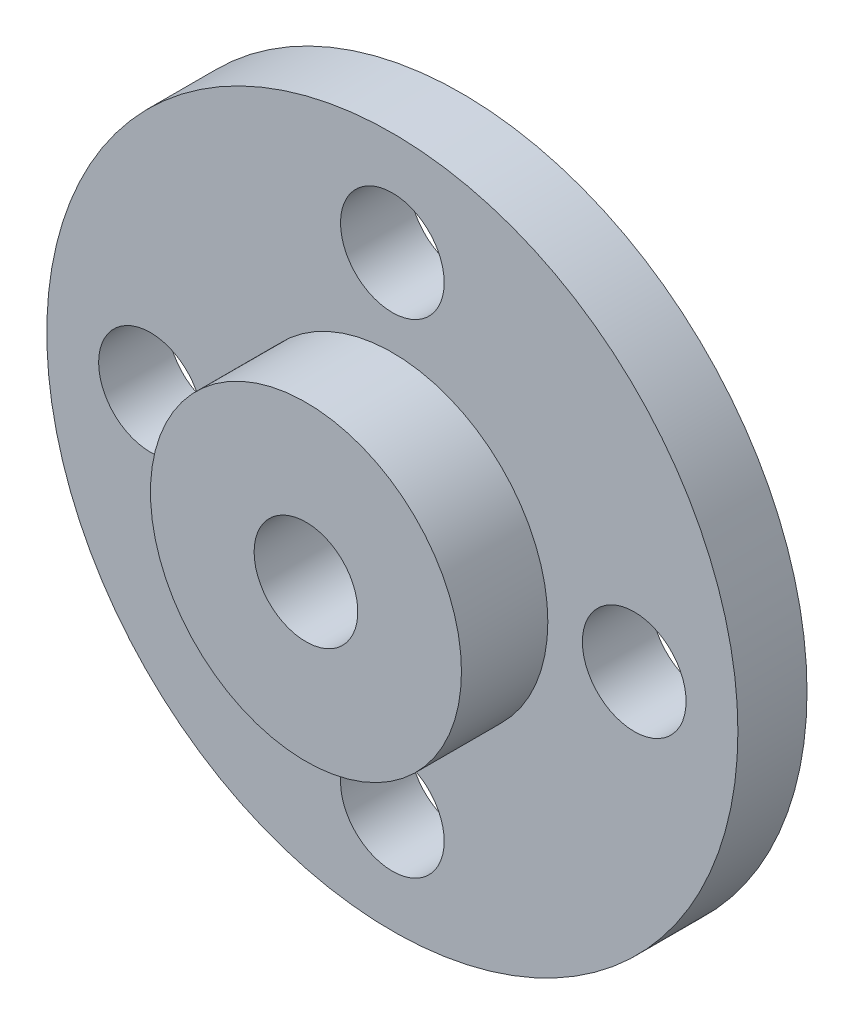
ISO-10303-21;
HEADER;
FILE_DESCRIPTION(('STEP AP214'),'2;1');
FILE_NAME('part.step','',(''),(''),'','','');
FILE_SCHEMA(('AUTOMOTIVE_DESIGN { 1 0 10303 214 1 1 1 1 }'));
ENDSEC;
DATA;
#1=APPLICATION_CONTEXT('core data for automotive mechanical design processes');
#2=APPLICATION_PROTOCOL_DEFINITION('international standard','automotive_design',2000,#1);
#3=PRODUCT_CONTEXT('',#1,'mechanical');
#4=PRODUCT('Part','Part','',(#3));
#5=PRODUCT_RELATED_PRODUCT_CATEGORY('part','',(#4));
#6=PRODUCT_DEFINITION_FORMATION('','',#4);
#7=PRODUCT_DEFINITION_CONTEXT('part definition',#1,'design');
#8=PRODUCT_DEFINITION('design','',#6,#7);
#9=PRODUCT_DEFINITION_SHAPE('','',#8);
#10=(LENGTH_UNIT() NAMED_UNIT(*) SI_UNIT(.MILLI.,.METRE.));
#11=(NAMED_UNIT(*) PLANE_ANGLE_UNIT() SI_UNIT($,.RADIAN.));
#12=(NAMED_UNIT(*) SI_UNIT($,.STERADIAN.) SOLID_ANGLE_UNIT());
#13=UNCERTAINTY_MEASURE_WITH_UNIT(LENGTH_MEASURE(1.E-05),#10,'distance_accuracy_value','');
#14=(GEOMETRIC_REPRESENTATION_CONTEXT(3) GLOBAL_UNCERTAINTY_ASSIGNED_CONTEXT((#13)) GLOBAL_UNIT_ASSIGNED_CONTEXT((#10,
#11,#12)) REPRESENTATION_CONTEXT('',''));
#15=CARTESIAN_POINT('',(0.,0.,0.));
#16=DIRECTION('',(0.,0.,1.));
#17=DIRECTION('',(1.,0.,0.));
#18=AXIS2_PLACEMENT_3D('',#15,#16,#17);
#19=CARTESIAN_POINT('',(0.,0.,2.));
#20=DIRECTION('',(0.,0.,-1.));
#21=DIRECTION('',(-1.,0.,0.));
#22=AXIS2_PLACEMENT_3D('',#19,#20,#21);
#23=CYLINDRICAL_SURFACE('',#22,10.);
#24=CARTESIAN_POINT('',(0.,0.,2.));
#25=DIRECTION('',(0.,0.,1.));
#26=DIRECTION('',(1.,0.,0.));
#27=AXIS2_PLACEMENT_3D('',#24,#25,#26);
#28=CIRCLE('',#27,10.);
#29=CARTESIAN_POINT('',(10.,0.,2.));
#30=VERTEX_POINT('',#29);
#31=EDGE_CURVE('E50',#30,#30,#28,.T.);
#32=ORIENTED_EDGE('',*,*,#31,.F.);
#33=EDGE_LOOP('',(#32));
#34=FACE_BOUND('',#33,.T.);
#35=CARTESIAN_POINT('',(0.,0.,0.));
#36=DIRECTION('',(0.,0.,1.));
#37=DIRECTION('',(1.,0.,0.));
#38=AXIS2_PLACEMENT_3D('',#35,#36,#37);
#39=CIRCLE('',#38,10.);
#40=CARTESIAN_POINT('',(10.,0.,0.));
#41=VERTEX_POINT('',#40);
#42=EDGE_CURVE('E46',#41,#41,#39,.T.);
#43=ORIENTED_EDGE('',*,*,#42,.T.);
#44=EDGE_LOOP('',(#43));
#45=FACE_BOUND('',#44,.T.);
#46=ADVANCED_FACE('F43',(#34,#45),#23,.T.);
#47=CARTESIAN_POINT('',(0.,0.,2.));
#48=DIRECTION('',(0.,0.,1.));
#49=DIRECTION('',(1.,0.,0.));
#50=AXIS2_PLACEMENT_3D('',#47,#48,#49);
#51=PLANE('',#50);
#52=CARTESIAN_POINT('',(1.96836904414743E-13,7.,2.));
#53=DIRECTION('',(0.,0.,1.));
#54=DIRECTION('',(1.,0.,0.));
#55=AXIS2_PLACEMENT_3D('',#52,#53,#54);
#56=CIRCLE('',#55,1.5);
#57=CARTESIAN_POINT('',(1.5000000000002,7.,2.));
#58=VERTEX_POINT('',#57);
#59=EDGE_CURVE('E59',#58,#58,#56,.T.);
#60=ORIENTED_EDGE('',*,*,#59,.F.);
#61=EDGE_LOOP('',(#60));
#62=FACE_BOUND('',#61,.T.);
#63=CARTESIAN_POINT('',(-7.,1.98097289440258E-13,2.));
#64=DIRECTION('',(0.,0.,1.));
#65=DIRECTION('',(1.,0.,0.));
#66=AXIS2_PLACEMENT_3D('',#63,#64,#65);
#67=CIRCLE('',#66,1.5);
#68=CARTESIAN_POINT('',(-5.5,1.98097289440258E-13,2.));
#69=VERTEX_POINT('',#68);
#70=EDGE_CURVE('E62',#69,#69,#67,.T.);
#71=ORIENTED_EDGE('',*,*,#70,.F.);
#72=EDGE_LOOP('',(#71));
#73=FACE_BOUND('',#72,.T.);
#74=CARTESIAN_POINT('',(-1.97704266152732E-13,-7.,2.));
#75=DIRECTION('',(0.,0.,1.));
#76=DIRECTION('',(1.,0.,0.));
#77=AXIS2_PLACEMENT_3D('',#74,#75,#76);
#78=CIRCLE('',#77,1.5);
#79=CARTESIAN_POINT('',(1.4999999999998,-7.,2.));
#80=VERTEX_POINT('',#79);
#81=EDGE_CURVE('E65',#80,#80,#78,.T.);
#82=ORIENTED_EDGE('',*,*,#81,.F.);
#83=EDGE_LOOP('',(#82));
#84=FACE_BOUND('',#83,.T.);
#85=CARTESIAN_POINT('',(7.,-1.98097289440258E-13,2.));
#86=DIRECTION('',(0.,0.,1.));
#87=DIRECTION('',(1.,0.,0.));
#88=AXIS2_PLACEMENT_3D('',#85,#86,#87);
#89=CIRCLE('',#88,1.5);
#90=CARTESIAN_POINT('',(8.5,-1.98097289440258E-13,2.));
#91=VERTEX_POINT('',#90);
#92=EDGE_CURVE('E68',#91,#91,#89,.T.);
#93=ORIENTED_EDGE('',*,*,#92,.F.);
#94=EDGE_LOOP('',(#93));
#95=FACE_BOUND('',#94,.T.);
#96=CARTESIAN_POINT('',(0.,0.,2.));
#97=DIRECTION('',(0.,0.,1.));
#98=DIRECTION('',(1.,0.,0.));
#99=AXIS2_PLACEMENT_3D('',#96,#97,#98);
#100=CIRCLE('',#99,4.5);
#101=CARTESIAN_POINT('',(4.5,0.,2.));
#102=VERTEX_POINT('',#101);
#103=EDGE_CURVE('E10',#102,#102,#100,.T.);
#104=ORIENTED_EDGE('',*,*,#103,.F.);
#105=EDGE_LOOP('',(#104));
#106=FACE_BOUND('',#105,.T.);
#107=ORIENTED_EDGE('',*,*,#31,.T.);
#108=EDGE_LOOP('',(#107));
#109=FACE_BOUND('',#108,.T.);
#110=ADVANCED_FACE('F104',(#62,#73,#84,#95,#106,#109),#51,.T.);
#111=CARTESIAN_POINT('',(0.,0.,0.));
#112=DIRECTION('',(0.,0.,1.));
#113=DIRECTION('',(1.,0.,0.));
#114=AXIS2_PLACEMENT_3D('',#111,#112,#113);
#115=PLANE('',#114);
#116=CARTESIAN_POINT('',(0.,0.,0.));
#117=DIRECTION('',(0.,0.,-1.));
#118=DIRECTION('',(-1.,0.,0.));
#119=AXIS2_PLACEMENT_3D('',#116,#117,#118);
#120=CIRCLE('',#119,1.5);
#121=CARTESIAN_POINT('',(-1.5,0.,0.));
#122=VERTEX_POINT('',#121);
#123=EDGE_CURVE('E84',#122,#122,#120,.T.);
#124=ORIENTED_EDGE('',*,*,#123,.F.);
#125=EDGE_LOOP('',(#124));
#126=FACE_BOUND('',#125,.T.);
#127=CARTESIAN_POINT('',(1.96836904414743E-13,7.,0.));
#128=DIRECTION('',(0.,0.,-1.));
#129=DIRECTION('',(-1.,0.,0.));
#130=AXIS2_PLACEMENT_3D('',#127,#128,#129);
#131=CIRCLE('',#130,1.5);
#132=CARTESIAN_POINT('',(-1.4999999999998,7.,0.));
#133=VERTEX_POINT('',#132);
#134=EDGE_CURVE('E71',#133,#133,#131,.T.);
#135=ORIENTED_EDGE('',*,*,#134,.F.);
#136=EDGE_LOOP('',(#135));
#137=FACE_BOUND('',#136,.T.);
#138=CARTESIAN_POINT('',(-7.,1.98097289440258E-13,0.));
#139=DIRECTION('',(0.,0.,-1.));
#140=DIRECTION('',(-1.,0.,0.));
#141=AXIS2_PLACEMENT_3D('',#138,#139,#140);
#142=CIRCLE('',#141,1.5);
#143=CARTESIAN_POINT('',(-8.5,1.98097289440258E-13,0.));
#144=VERTEX_POINT('',#143);
#145=EDGE_CURVE('E79',#144,#144,#142,.T.);
#146=ORIENTED_EDGE('',*,*,#145,.F.);
#147=EDGE_LOOP('',(#146));
#148=FACE_BOUND('',#147,.T.);
#149=CARTESIAN_POINT('',(-1.97704266152732E-13,-7.,0.));
#150=DIRECTION('',(0.,0.,-1.));
#151=DIRECTION('',(-1.,0.,0.));
#152=AXIS2_PLACEMENT_3D('',#149,#150,#151);
#153=CIRCLE('',#152,1.5);
#154=CARTESIAN_POINT('',(-1.5000000000002,-7.,0.));
#155=VERTEX_POINT('',#154);
#156=EDGE_CURVE('E75',#155,#155,#153,.T.);
#157=ORIENTED_EDGE('',*,*,#156,.F.);
#158=EDGE_LOOP('',(#157));
#159=FACE_BOUND('',#158,.T.);
#160=CARTESIAN_POINT('',(7.,-1.98097289440258E-13,0.));
#161=DIRECTION('',(0.,0.,-1.));
#162=DIRECTION('',(-1.,0.,0.));
#163=AXIS2_PLACEMENT_3D('',#160,#161,#162);
#164=CIRCLE('',#163,1.5);
#165=CARTESIAN_POINT('',(5.5,-1.98097289440258E-13,0.));
#166=VERTEX_POINT('',#165);
#167=EDGE_CURVE('E72',#166,#166,#164,.T.);
#168=ORIENTED_EDGE('',*,*,#167,.F.);
#169=EDGE_LOOP('',(#168));
#170=FACE_BOUND('',#169,.T.);
#171=ORIENTED_EDGE('',*,*,#42,.F.);
#172=EDGE_LOOP('',(#171));
#173=FACE_BOUND('',#172,.T.);
#174=ADVANCED_FACE('F100',(#126,#137,#148,#159,#170,#173),#115,.F.);
#175=CARTESIAN_POINT('',(0.,0.,4.5));
#176=DIRECTION('',(0.,0.,-1.));
#177=DIRECTION('',(-1.,0.,0.));
#178=AXIS2_PLACEMENT_3D('',#175,#176,#177);
#179=CYLINDRICAL_SURFACE('',#178,4.5);
#180=CARTESIAN_POINT('',(0.,0.,4.5));
#181=DIRECTION('',(0.,0.,1.));
#182=DIRECTION('',(1.,0.,0.));
#183=AXIS2_PLACEMENT_3D('',#180,#181,#182);
#184=CIRCLE('',#183,4.5);
#185=CARTESIAN_POINT('',(4.5,0.,4.5));
#186=VERTEX_POINT('',#185);
#187=EDGE_CURVE('E56',#186,#186,#184,.T.);
#188=ORIENTED_EDGE('',*,*,#187,.F.);
#189=EDGE_LOOP('',(#188));
#190=FACE_BOUND('',#189,.T.);
#191=ORIENTED_EDGE('',*,*,#103,.T.);
#192=EDGE_LOOP('',(#191));
#193=FACE_BOUND('',#192,.T.);
#194=ADVANCED_FACE('F103',(#190,#193),#179,.T.);
#195=CARTESIAN_POINT('',(0.,0.,4.5));
#196=DIRECTION('',(0.,0.,1.));
#197=DIRECTION('',(1.,0.,0.));
#198=AXIS2_PLACEMENT_3D('',#195,#196,#197);
#199=PLANE('',#198);
#200=CARTESIAN_POINT('',(0.,0.,4.5));
#201=DIRECTION('',(0.,0.,-1.));
#202=DIRECTION('',(-1.,0.,0.));
#203=AXIS2_PLACEMENT_3D('',#200,#201,#202);
#204=CIRCLE('',#203,1.5);
#205=CARTESIAN_POINT('',(-1.5,0.,4.5));
#206=VERTEX_POINT('',#205);
#207=EDGE_CURVE('E76',#206,#206,#204,.T.);
#208=ORIENTED_EDGE('',*,*,#207,.T.);
#209=EDGE_LOOP('',(#208));
#210=FACE_BOUND('',#209,.T.);
#211=ORIENTED_EDGE('',*,*,#187,.T.);
#212=EDGE_LOOP('',(#211));
#213=FACE_BOUND('',#212,.T.);
#214=ADVANCED_FACE('F90',(#210,#213),#199,.T.);
#215=CARTESIAN_POINT('',(7.,-1.98097289440258E-13,2.5));
#216=DIRECTION('',(0.,0.,-1.));
#217=DIRECTION('',(-1.,0.,0.));
#218=AXIS2_PLACEMENT_3D('',#215,#216,#217);
#219=CYLINDRICAL_SURFACE('',#218,1.5);
#220=ORIENTED_EDGE('',*,*,#92,.T.);
#221=EDGE_LOOP('',(#220));
#222=FACE_BOUND('',#221,.T.);
#223=ORIENTED_EDGE('',*,*,#167,.T.);
#224=EDGE_LOOP('',(#223));
#225=FACE_BOUND('',#224,.T.);
#226=ADVANCED_FACE('F136',(#222,#225),#219,.F.);
#227=CARTESIAN_POINT('',(-1.97704266152732E-13,-7.,2.5));
#228=DIRECTION('',(0.,0.,-1.));
#229=DIRECTION('',(-1.,0.,0.));
#230=AXIS2_PLACEMENT_3D('',#227,#228,#229);
#231=CYLINDRICAL_SURFACE('',#230,1.5);
#232=ORIENTED_EDGE('',*,*,#81,.T.);
#233=EDGE_LOOP('',(#232));
#234=FACE_BOUND('',#233,.T.);
#235=ORIENTED_EDGE('',*,*,#156,.T.);
#236=EDGE_LOOP('',(#235));
#237=FACE_BOUND('',#236,.T.);
#238=ADVANCED_FACE('F138',(#234,#237),#231,.F.);
#239=CARTESIAN_POINT('',(-7.,1.98097289440258E-13,2.5));
#240=DIRECTION('',(0.,0.,-1.));
#241=DIRECTION('',(-1.,0.,0.));
#242=AXIS2_PLACEMENT_3D('',#239,#240,#241);
#243=CYLINDRICAL_SURFACE('',#242,1.5);
#244=ORIENTED_EDGE('',*,*,#70,.T.);
#245=EDGE_LOOP('',(#244));
#246=FACE_BOUND('',#245,.T.);
#247=ORIENTED_EDGE('',*,*,#145,.T.);
#248=EDGE_LOOP('',(#247));
#249=FACE_BOUND('',#248,.T.);
#250=ADVANCED_FACE('F142',(#246,#249),#243,.F.);
#251=CARTESIAN_POINT('',(1.96836904414743E-13,7.,2.5));
#252=DIRECTION('',(0.,0.,-1.));
#253=DIRECTION('',(-1.,0.,0.));
#254=AXIS2_PLACEMENT_3D('',#251,#252,#253);
#255=CYLINDRICAL_SURFACE('',#254,1.5);
#256=ORIENTED_EDGE('',*,*,#59,.T.);
#257=EDGE_LOOP('',(#256));
#258=FACE_BOUND('',#257,.T.);
#259=ORIENTED_EDGE('',*,*,#134,.T.);
#260=EDGE_LOOP('',(#259));
#261=FACE_BOUND('',#260,.T.);
#262=ADVANCED_FACE('F96',(#258,#261),#255,.F.);
#263=CARTESIAN_POINT('',(0.,0.,4.5));
#264=DIRECTION('',(0.,0.,-1.));
#265=DIRECTION('',(-1.,0.,0.));
#266=AXIS2_PLACEMENT_3D('',#263,#264,#265);
#267=CYLINDRICAL_SURFACE('',#266,1.5);
#268=ORIENTED_EDGE('',*,*,#207,.F.);
#269=EDGE_LOOP('',(#268));
#270=FACE_BOUND('',#269,.T.);
#271=ORIENTED_EDGE('',*,*,#123,.T.);
#272=EDGE_LOOP('',(#271));
#273=FACE_BOUND('',#272,.T.);
#274=ADVANCED_FACE('F93',(#270,#273),#267,.F.);
#275=CLOSED_SHELL('',(#46,#110,#174,#194,#214,#226,#238,#250,#262,#274));
#276=MANIFOLD_SOLID_BREP('B2',#275);
#277=ADVANCED_BREP_SHAPE_REPRESENTATION('',(#18,#276),#14);
#278=SHAPE_DEFINITION_REPRESENTATION(#9,#277);
ENDSEC;
END-ISO-10303-21;
